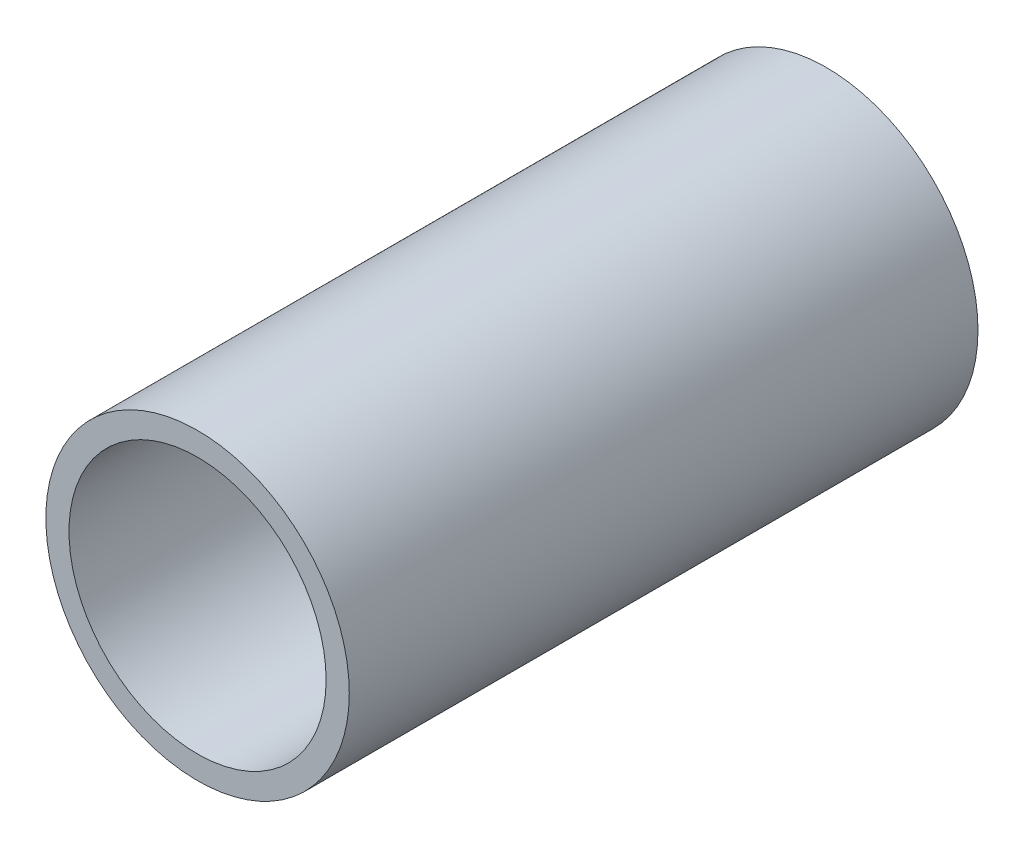
ISO-10303-21;
HEADER;
FILE_DESCRIPTION(('STEP AP214'),'2;1');
FILE_NAME('part.step','',(''),(''),'','','');
FILE_SCHEMA(('AUTOMOTIVE_DESIGN { 1 0 10303 214 1 1 1 1 }'));
ENDSEC;
DATA;
#1=APPLICATION_CONTEXT('core data for automotive mechanical design processes');
#2=APPLICATION_PROTOCOL_DEFINITION('international standard','automotive_design',2000,#1);
#3=PRODUCT_CONTEXT('',#1,'mechanical');
#4=PRODUCT('Part','Part','',(#3));
#5=PRODUCT_RELATED_PRODUCT_CATEGORY('part','',(#4));
#6=PRODUCT_DEFINITION_FORMATION('','',#4);
#7=PRODUCT_DEFINITION_CONTEXT('part definition',#1,'design');
#8=PRODUCT_DEFINITION('design','',#6,#7);
#9=PRODUCT_DEFINITION_SHAPE('','',#8);
#10=(LENGTH_UNIT() NAMED_UNIT(*) SI_UNIT(.MILLI.,.METRE.));
#11=(NAMED_UNIT(*) PLANE_ANGLE_UNIT() SI_UNIT($,.RADIAN.));
#12=(NAMED_UNIT(*) SI_UNIT($,.STERADIAN.) SOLID_ANGLE_UNIT());
#13=UNCERTAINTY_MEASURE_WITH_UNIT(LENGTH_MEASURE(1.E-05),#10,'distance_accuracy_value','');
#14=(GEOMETRIC_REPRESENTATION_CONTEXT(3) GLOBAL_UNCERTAINTY_ASSIGNED_CONTEXT((#13)) GLOBAL_UNIT_ASSIGNED_CONTEXT((#10,
#11,#12)) REPRESENTATION_CONTEXT('',''));
#15=CARTESIAN_POINT('',(0.,0.,0.));
#16=DIRECTION('',(0.,0.,1.));
#17=DIRECTION('',(1.,0.,0.));
#18=AXIS2_PLACEMENT_3D('',#15,#16,#17);
#19=CARTESIAN_POINT('',(0.,0.,50.));
#20=DIRECTION('',(0.,0.,1.));
#21=DIRECTION('',(1.,0.,0.));
#22=AXIS2_PLACEMENT_3D('',#19,#20,#21);
#23=PLANE('',#22);
#24=CARTESIAN_POINT('',(0.,0.,50.));
#25=DIRECTION('',(0.,0.,1.));
#26=DIRECTION('',(1.,0.,0.));
#27=AXIS2_PLACEMENT_3D('',#24,#25,#26);
#28=CIRCLE('',#27,24.13);
#29=CARTESIAN_POINT('',(24.13,0.,50.));
#30=VERTEX_POINT('',#29);
#31=EDGE_CURVE('E10',#30,#30,#28,.T.);
#32=ORIENTED_EDGE('',*,*,#31,.T.);
#33=EDGE_LOOP('',(#32));
#34=FACE_BOUND('',#33,.T.);
#35=CARTESIAN_POINT('',(0.,0.,50.));
#36=DIRECTION('',(0.,0.,1.));
#37=DIRECTION('',(1.,0.,0.));
#38=AXIS2_PLACEMENT_3D('',#35,#36,#37);
#39=CIRCLE('',#38,20.447);
#40=CARTESIAN_POINT('',(20.447,0.,50.));
#41=VERTEX_POINT('',#40);
#42=EDGE_CURVE('E50',#41,#41,#39,.T.);
#43=ORIENTED_EDGE('',*,*,#42,.F.);
#44=EDGE_LOOP('',(#43));
#45=FACE_BOUND('',#44,.T.);
#46=ADVANCED_FACE('F39',(#34,#45),#23,.T.);
#47=CARTESIAN_POINT('',(0.,0.,-50.));
#48=DIRECTION('',(0.,0.,1.));
#49=DIRECTION('',(1.,0.,0.));
#50=AXIS2_PLACEMENT_3D('',#47,#48,#49);
#51=PLANE('',#50);
#52=CARTESIAN_POINT('',(0.,0.,-50.));
#53=DIRECTION('',(0.,0.,1.));
#54=DIRECTION('',(1.,0.,0.));
#55=AXIS2_PLACEMENT_3D('',#52,#53,#54);
#56=CIRCLE('',#55,24.13);
#57=CARTESIAN_POINT('',(24.13,0.,-50.));
#58=VERTEX_POINT('',#57);
#59=EDGE_CURVE('E43',#58,#58,#56,.T.);
#60=ORIENTED_EDGE('',*,*,#59,.F.);
#61=EDGE_LOOP('',(#60));
#62=FACE_BOUND('',#61,.T.);
#63=CARTESIAN_POINT('',(0.,0.,-50.));
#64=DIRECTION('',(0.,0.,1.));
#65=DIRECTION('',(1.,0.,0.));
#66=AXIS2_PLACEMENT_3D('',#63,#64,#65);
#67=CIRCLE('',#66,20.447);
#68=CARTESIAN_POINT('',(20.447,0.,-50.));
#69=VERTEX_POINT('',#68);
#70=EDGE_CURVE('E52',#69,#69,#67,.T.);
#71=ORIENTED_EDGE('',*,*,#70,.T.);
#72=EDGE_LOOP('',(#71));
#73=FACE_BOUND('',#72,.T.);
#74=ADVANCED_FACE('F62',(#62,#73),#51,.F.);
#75=CARTESIAN_POINT('',(0.,0.,50.));
#76=DIRECTION('',(0.,0.,-1.));
#77=DIRECTION('',(-1.,0.,0.));
#78=AXIS2_PLACEMENT_3D('',#75,#76,#77);
#79=CYLINDRICAL_SURFACE('',#78,24.13);
#80=ORIENTED_EDGE('',*,*,#31,.F.);
#81=EDGE_LOOP('',(#80));
#82=FACE_BOUND('',#81,.T.);
#83=ORIENTED_EDGE('',*,*,#59,.T.);
#84=EDGE_LOOP('',(#83));
#85=FACE_BOUND('',#84,.T.);
#86=ADVANCED_FACE('F41',(#82,#85),#79,.T.);
#87=CARTESIAN_POINT('',(0.,0.,50.));
#88=DIRECTION('',(0.,0.,-1.));
#89=DIRECTION('',(-1.,0.,0.));
#90=AXIS2_PLACEMENT_3D('',#87,#88,#89);
#91=CYLINDRICAL_SURFACE('',#90,20.447);
#92=ORIENTED_EDGE('',*,*,#42,.T.);
#93=EDGE_LOOP('',(#92));
#94=FACE_BOUND('',#93,.T.);
#95=ORIENTED_EDGE('',*,*,#70,.F.);
#96=EDGE_LOOP('',(#95));
#97=FACE_BOUND('',#96,.T.);
#98=ADVANCED_FACE('F58',(#94,#97),#91,.F.);
#99=CLOSED_SHELL('',(#46,#74,#86,#98));
#100=MANIFOLD_SOLID_BREP('B2',#99);
#101=ADVANCED_BREP_SHAPE_REPRESENTATION('',(#18,#100),#14);
#102=SHAPE_DEFINITION_REPRESENTATION(#9,#101);
ENDSEC;
END-ISO-10303-21;
